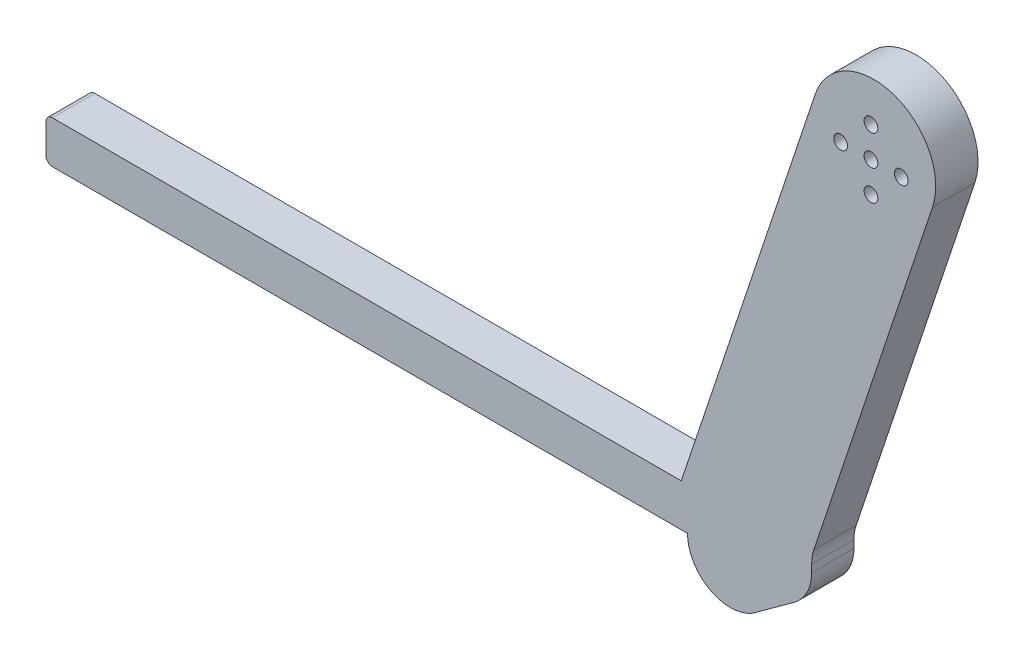
ISO-10303-21;
HEADER;
FILE_DESCRIPTION(('STEP AP214'),'2;1');
FILE_NAME('part.step','',(''),(''),'','','');
FILE_SCHEMA(('AUTOMOTIVE_DESIGN { 1 0 10303 214 1 1 1 1 }'));
ENDSEC;
DATA;
#1=APPLICATION_CONTEXT('core data for automotive mechanical design processes');
#2=APPLICATION_PROTOCOL_DEFINITION('international standard','automotive_design',2000,#1);
#3=PRODUCT_CONTEXT('',#1,'mechanical');
#4=PRODUCT('Part','Part','',(#3));
#5=PRODUCT_RELATED_PRODUCT_CATEGORY('part','',(#4));
#6=PRODUCT_DEFINITION_FORMATION('','',#4);
#7=PRODUCT_DEFINITION_CONTEXT('part definition',#1,'design');
#8=PRODUCT_DEFINITION('design','',#6,#7);
#9=PRODUCT_DEFINITION_SHAPE('','',#8);
#10=(LENGTH_UNIT() NAMED_UNIT(*) SI_UNIT(.MILLI.,.METRE.));
#11=(NAMED_UNIT(*) PLANE_ANGLE_UNIT() SI_UNIT($,.RADIAN.));
#12=(NAMED_UNIT(*) SI_UNIT($,.STERADIAN.) SOLID_ANGLE_UNIT());
#13=UNCERTAINTY_MEASURE_WITH_UNIT(LENGTH_MEASURE(1.E-05),#10,'distance_accuracy_value','');
#14=(GEOMETRIC_REPRESENTATION_CONTEXT(3) GLOBAL_UNCERTAINTY_ASSIGNED_CONTEXT((#13)) GLOBAL_UNIT_ASSIGNED_CONTEXT((#10,
#11,#12)) REPRESENTATION_CONTEXT('',''));
#15=CARTESIAN_POINT('',(0.,0.,0.));
#16=DIRECTION('',(0.,0.,1.));
#17=DIRECTION('',(1.,0.,0.));
#18=AXIS2_PLACEMENT_3D('',#15,#16,#17);
#19=CARTESIAN_POINT('',(-148.5,-1.50000000000002,10.));
#20=DIRECTION('',(0.,0.,1.));
#21=DIRECTION('',(1.,0.,0.));
#22=AXIS2_PLACEMENT_3D('',#19,#20,#21);
#23=PLANE('',#22);
#24=CARTESIAN_POINT('',(51.946529943188,88.1014202913223,10.));
#25=DIRECTION('',(0.,0.,1.));
#26=DIRECTION('',(1.,0.,0.));
#27=AXIS2_PLACEMENT_3D('',#24,#25,#26);
#28=CIRCLE('',#27,1.62000000000001);
#29=CARTESIAN_POINT('',(53.566529943188,88.1014202913223,10.));
#30=VERTEX_POINT('',#29);
#31=EDGE_CURVE('E402',#30,#30,#28,.T.);
#32=ORIENTED_EDGE('',*,*,#31,.F.);
#33=EDGE_LOOP('',(#32));
#34=FACE_BOUND('',#33,.T.);
#35=CARTESIAN_POINT('',(44.787529943188,88.1014202913223,10.));
#36=DIRECTION('',(0.,0.,1.));
#37=DIRECTION('',(1.,0.,0.));
#38=AXIS2_PLACEMENT_3D('',#35,#36,#37);
#39=CIRCLE('',#38,1.62000000000001);
#40=CARTESIAN_POINT('',(46.407529943188,88.1014202913223,10.));
#41=VERTEX_POINT('',#40);
#42=EDGE_CURVE('E405',#41,#41,#39,.T.);
#43=ORIENTED_EDGE('',*,*,#42,.F.);
#44=EDGE_LOOP('',(#43));
#45=FACE_BOUND('',#44,.T.);
#46=CARTESIAN_POINT('',(44.787529943188,95.2604202913223,10.));
#47=DIRECTION('',(0.,0.,1.));
#48=DIRECTION('',(1.,0.,0.));
#49=AXIS2_PLACEMENT_3D('',#46,#47,#48);
#50=CIRCLE('',#49,1.62000000000001);
#51=CARTESIAN_POINT('',(46.407529943188,95.2604202913223,10.));
#52=VERTEX_POINT('',#51);
#53=EDGE_CURVE('E401',#52,#52,#50,.T.);
#54=ORIENTED_EDGE('',*,*,#53,.F.);
#55=EDGE_LOOP('',(#54));
#56=FACE_BOUND('',#55,.T.);
#57=CARTESIAN_POINT('',(-148.5,-1.50000000000002,10.));
#58=DIRECTION('',(0.,0.,1.));
#59=DIRECTION('',(1.,0.,0.));
#60=AXIS2_PLACEMENT_3D('',#57,#58,#59);
#61=CIRCLE('',#60,1.5);
#62=CARTESIAN_POINT('',(-148.5,0.,10.));
#63=VERTEX_POINT('',#62);
#64=CARTESIAN_POINT('',(-150.,-1.5,10.));
#65=VERTEX_POINT('',#64);
#66=EDGE_CURVE('E200',#63,#65,#61,.T.);
#67=ORIENTED_EDGE('',*,*,#66,.T.);
#68=DIRECTION('',(0.,-1.,0.));
#69=VECTOR('',#68,1.);
#70=CARTESIAN_POINT('',(-150.,-1.5,10.));
#71=LINE('',#70,#69);
#72=CARTESIAN_POINT('',(-150.,-8.50000000000002,10.));
#73=VERTEX_POINT('',#72);
#74=EDGE_CURVE('E110',#65,#73,#71,.T.);
#75=ORIENTED_EDGE('',*,*,#74,.T.);
#76=CARTESIAN_POINT('',(-148.5,-8.50000000000002,10.));
#77=DIRECTION('',(0.,0.,1.));
#78=DIRECTION('',(1.,0.,0.));
#79=AXIS2_PLACEMENT_3D('',#76,#77,#78);
#80=CIRCLE('',#79,1.49999999999999);
#81=CARTESIAN_POINT('',(-148.5,-10.,10.));
#82=VERTEX_POINT('',#81);
#83=EDGE_CURVE('E227',#73,#82,#80,.T.);
#84=ORIENTED_EDGE('',*,*,#83,.T.);
#85=DIRECTION('',(1.,0.,0.));
#86=VECTOR('',#85,1.);
#87=CARTESIAN_POINT('',(-148.5,-10.,10.));
#88=LINE('',#87,#86);
#89=CARTESIAN_POINT('',(1.47401029250903,-10.,10.));
#90=VERTEX_POINT('',#89);
#91=EDGE_CURVE('E244',#82,#90,#88,.T.);
#92=ORIENTED_EDGE('',*,*,#91,.T.);
#93=CARTESIAN_POINT('',(11.5907783371728,-10.,10.));
#94=DIRECTION('',(0.,0.,1.));
#95=DIRECTION('',(1.,0.,0.));
#96=AXIS2_PLACEMENT_3D('',#93,#94,#95);
#97=CIRCLE('',#96,10.1167680446638);
#98=CARTESIAN_POINT('',(18.1803002583485,-17.6764051821068,10.));
#99=VERTEX_POINT('',#98);
#100=EDGE_CURVE('E241',#90,#99,#97,.T.);
#101=ORIENTED_EDGE('',*,*,#100,.T.);
#102=DIRECTION('',(0.808447886643731,0.588567765496281,0.));
#103=VECTOR('',#102,1.);
#104=CARTESIAN_POINT('',(18.1803002583485,-17.6764051821068,10.));
#105=LINE('',#104,#103);
#106=CARTESIAN_POINT('',(26.6705509316881,-11.4953167658129,10.));
#107=VERTEX_POINT('',#106);
#108=EDGE_CURVE('E243',#99,#107,#105,.T.);
#109=ORIENTED_EDGE('',*,*,#108,.T.);
#110=CARTESIAN_POINT('',(20.7848732767254,-3.41083789937558,10.));
#111=DIRECTION('',(0.,0.,-1.));
#112=DIRECTION('',(-1.,0.,0.));
#113=AXIS2_PLACEMENT_3D('',#110,#111,#112);
#114=CIRCLE('',#113,10.);
#115=CARTESIAN_POINT('',(30.7848732767254,-3.41083789937554,10.));
#116=VERTEX_POINT('',#115);
#117=EDGE_CURVE('E246',#116,#107,#114,.T.);
#118=ORIENTED_EDGE('',*,*,#117,.F.);
#119=DIRECTION('',(0.,1.,0.));
#120=VECTOR('',#119,1.);
#121=CARTESIAN_POINT('',(30.7848732767254,-3.41083789937554,10.));
#122=LINE('',#121,#120);
#123=CARTESIAN_POINT('',(30.7848732767254,-1.62277660168383,10.));
#124=VERTEX_POINT('',#123);
#125=EDGE_CURVE('E253',#116,#124,#122,.T.);
#126=ORIENTED_EDGE('',*,*,#125,.T.);
#127=CARTESIAN_POINT('',(40.7848732767254,-1.62277660168379,10.));
#128=DIRECTION('',(0.,0.,1.));
#129=DIRECTION('',(1.,0.,0.));
#130=AXIS2_PLACEMENT_3D('',#127,#128,#129);
#131=CIRCLE('',#130,10.);
#132=CARTESIAN_POINT('',(31.2980402962202,1.53950105848462,10.));
#133=VERTEX_POINT('',#132);
#134=EDGE_CURVE('E255',#133,#124,#131,.T.);
#135=ORIENTED_EDGE('',*,*,#134,.F.);
#136=DIRECTION('',(0.316227766016838,0.948683298050514,0.));
#137=VECTOR('',#136,1.);
#138=CARTESIAN_POINT('',(31.2980402962202,1.53950105848462,10.));
#139=LINE('',#138,#137);
#140=CARTESIAN_POINT('',(59.3291625507366,85.6328678220338,10.));
#141=VERTEX_POINT('',#140);
#142=EDGE_CURVE('E159',#133,#141,#139,.T.);
#143=ORIENTED_EDGE('',*,*,#142,.T.);
#144=CARTESIAN_POINT('',(45.4759695762102,90.2505988135426,10.));
#145=DIRECTION('',(0.,0.,-1.));
#146=DIRECTION('',(-1.,0.,0.));
#147=AXIS2_PLACEMENT_3D('',#144,#145,#146);
#148=CIRCLE('',#147,14.6025475551155);
#149=CARTESIAN_POINT('',(31.6227766016838,94.8683298050514,10.));
#150=VERTEX_POINT('',#149);
#151=EDGE_CURVE('E144',#150,#141,#148,.T.);
#152=ORIENTED_EDGE('',*,*,#151,.F.);
#153=DIRECTION('',(0.316227766016838,0.948683298050514,0.));
#154=VECTOR('',#153,1.);
#155=CARTESIAN_POINT('',(0.,0.,10.));
#156=LINE('',#155,#154);
#157=CARTESIAN_POINT('',(0.,0.,10.));
#158=VERTEX_POINT('',#157);
#159=EDGE_CURVE('E156',#158,#150,#156,.T.);
#160=ORIENTED_EDGE('',*,*,#159,.F.);
#161=DIRECTION('',(1.,0.,0.));
#162=VECTOR('',#161,1.);
#163=CARTESIAN_POINT('',(-148.5,0.,10.));
#164=LINE('',#163,#162);
#165=EDGE_CURVE('E163',#63,#158,#164,.T.);
#166=ORIENTED_EDGE('',*,*,#165,.F.);
#167=EDGE_LOOP('',(#67,#75,#84,#92,#101,#109,#118,#126,#135,#143,#152,#160,#166));
#168=FACE_BOUND('',#167,.T.);
#169=CARTESIAN_POINT('',(44.787529943188,80.9424202913223,10.));
#170=DIRECTION('',(0.,0.,-1.));
#171=DIRECTION('',(-1.,0.,0.));
#172=AXIS2_PLACEMENT_3D('',#169,#170,#171);
#173=CIRCLE('',#172,1.62000000000001);
#174=CARTESIAN_POINT('',(43.167529943188,80.9424202913223,10.));
#175=VERTEX_POINT('',#174);
#176=EDGE_CURVE('E398',#175,#175,#173,.T.);
#177=ORIENTED_EDGE('',*,*,#176,.T.);
#178=EDGE_LOOP('',(#177));
#179=FACE_BOUND('',#178,.T.);
#180=CARTESIAN_POINT('',(37.628529943188,88.1014202913223,10.));
#181=DIRECTION('',(0.,0.,-1.));
#182=DIRECTION('',(-1.,0.,0.));
#183=AXIS2_PLACEMENT_3D('',#180,#181,#182);
#184=CIRCLE('',#183,1.62000000000001);
#185=CARTESIAN_POINT('',(36.008529943188,88.1014202913223,10.));
#186=VERTEX_POINT('',#185);
#187=EDGE_CURVE('E171',#186,#186,#184,.T.);
#188=ORIENTED_EDGE('',*,*,#187,.T.);
#189=EDGE_LOOP('',(#188));
#190=FACE_BOUND('',#189,.T.);
#191=ADVANCED_FACE('F39',(#34,#45,#56,#168,#179,#190),#23,.T.);
#192=CARTESIAN_POINT('',(-148.5,-1.50000000000002,0.));
#193=DIRECTION('',(0.,0.,1.));
#194=DIRECTION('',(1.,0.,0.));
#195=AXIS2_PLACEMENT_3D('',#192,#193,#194);
#196=PLANE('',#195);
#197=CARTESIAN_POINT('',(44.787529943188,88.1014202913223,0.));
#198=DIRECTION('',(0.,0.,1.));
#199=DIRECTION('',(1.,0.,0.));
#200=AXIS2_PLACEMENT_3D('',#197,#198,#199);
#201=CIRCLE('',#200,9.80000000000001);
#202=CARTESIAN_POINT('',(54.587529943188,88.1014202913223,0.));
#203=VERTEX_POINT('',#202);
#204=EDGE_CURVE('E382',#203,#203,#201,.T.);
#205=ORIENTED_EDGE('',*,*,#204,.T.);
#206=EDGE_LOOP('',(#205));
#207=FACE_BOUND('',#206,.T.);
#208=CARTESIAN_POINT('',(-148.5,-1.50000000000002,0.));
#209=DIRECTION('',(0.,0.,1.));
#210=DIRECTION('',(1.,0.,0.));
#211=AXIS2_PLACEMENT_3D('',#208,#209,#210);
#212=CIRCLE('',#211,1.5);
#213=CARTESIAN_POINT('',(-148.5,0.,0.));
#214=VERTEX_POINT('',#213);
#215=CARTESIAN_POINT('',(-150.,-1.5,0.));
#216=VERTEX_POINT('',#215);
#217=EDGE_CURVE('E168',#214,#216,#212,.T.);
#218=ORIENTED_EDGE('',*,*,#217,.F.);
#219=DIRECTION('',(1.,0.,0.));
#220=VECTOR('',#219,1.);
#221=CARTESIAN_POINT('',(-148.5,0.,0.));
#222=LINE('',#221,#220);
#223=CARTESIAN_POINT('',(0.,0.,0.));
#224=VERTEX_POINT('',#223);
#225=EDGE_CURVE('E197',#214,#224,#222,.T.);
#226=ORIENTED_EDGE('',*,*,#225,.T.);
#227=DIRECTION('',(0.316227766016838,0.948683298050514,0.));
#228=VECTOR('',#227,1.);
#229=CARTESIAN_POINT('',(0.,0.,0.));
#230=LINE('',#229,#228);
#231=CARTESIAN_POINT('',(31.6227766016838,94.8683298050514,0.));
#232=VERTEX_POINT('',#231);
#233=EDGE_CURVE('E195',#224,#232,#230,.T.);
#234=ORIENTED_EDGE('',*,*,#233,.T.);
#235=CARTESIAN_POINT('',(45.4759695762102,90.2505988135426,0.));
#236=DIRECTION('',(0.,0.,-1.));
#237=DIRECTION('',(-1.,0.,0.));
#238=AXIS2_PLACEMENT_3D('',#235,#236,#237);
#239=CIRCLE('',#238,14.6025475551155);
#240=CARTESIAN_POINT('',(59.3291625507366,85.6328678220338,0.));
#241=VERTEX_POINT('',#240);
#242=EDGE_CURVE('E146',#232,#241,#239,.T.);
#243=ORIENTED_EDGE('',*,*,#242,.T.);
#244=DIRECTION('',(0.316227766016838,0.948683298050514,0.));
#245=VECTOR('',#244,1.);
#246=CARTESIAN_POINT('',(31.2980402962202,1.53950105848462,0.));
#247=LINE('',#246,#245);
#248=CARTESIAN_POINT('',(31.2980402962202,1.53950105848462,0.));
#249=VERTEX_POINT('',#248);
#250=EDGE_CURVE('E191',#249,#241,#247,.T.);
#251=ORIENTED_EDGE('',*,*,#250,.F.);
#252=CARTESIAN_POINT('',(40.7848732767254,-1.62277660168379,0.));
#253=DIRECTION('',(0.,0.,1.));
#254=DIRECTION('',(1.,0.,0.));
#255=AXIS2_PLACEMENT_3D('',#252,#253,#254);
#256=CIRCLE('',#255,10.);
#257=CARTESIAN_POINT('',(30.7848732767254,-1.62277660168383,0.));
#258=VERTEX_POINT('',#257);
#259=EDGE_CURVE('E188',#249,#258,#256,.T.);
#260=ORIENTED_EDGE('',*,*,#259,.T.);
#261=DIRECTION('',(0.,1.,0.));
#262=VECTOR('',#261,1.);
#263=CARTESIAN_POINT('',(30.7848732767254,-3.41083789937554,0.));
#264=LINE('',#263,#262);
#265=CARTESIAN_POINT('',(30.7848732767254,-3.41083789937554,0.));
#266=VERTEX_POINT('',#265);
#267=EDGE_CURVE('E185',#266,#258,#264,.T.);
#268=ORIENTED_EDGE('',*,*,#267,.F.);
#269=CARTESIAN_POINT('',(20.7848732767254,-3.41083789937558,0.));
#270=DIRECTION('',(0.,0.,-1.));
#271=DIRECTION('',(-1.,0.,0.));
#272=AXIS2_PLACEMENT_3D('',#269,#270,#271);
#273=CIRCLE('',#272,10.);
#274=CARTESIAN_POINT('',(26.6705509316881,-11.4953167658129,0.));
#275=VERTEX_POINT('',#274);
#276=EDGE_CURVE('E182',#266,#275,#273,.T.);
#277=ORIENTED_EDGE('',*,*,#276,.T.);
#278=DIRECTION('',(0.808447886643731,0.588567765496281,0.));
#279=VECTOR('',#278,1.);
#280=CARTESIAN_POINT('',(18.1803002583485,-17.6764051821068,0.));
#281=LINE('',#280,#279);
#282=CARTESIAN_POINT('',(18.1803002583485,-17.6764051821068,0.));
#283=VERTEX_POINT('',#282);
#284=EDGE_CURVE('E179',#283,#275,#281,.T.);
#285=ORIENTED_EDGE('',*,*,#284,.F.);
#286=CARTESIAN_POINT('',(11.5907783371728,-10.,0.));
#287=DIRECTION('',(0.,0.,1.));
#288=DIRECTION('',(1.,0.,0.));
#289=AXIS2_PLACEMENT_3D('',#286,#287,#288);
#290=CIRCLE('',#289,10.1167680446638);
#291=CARTESIAN_POINT('',(1.47401029250903,-10.,0.));
#292=VERTEX_POINT('',#291);
#293=EDGE_CURVE('E177',#292,#283,#290,.T.);
#294=ORIENTED_EDGE('',*,*,#293,.F.);
#295=DIRECTION('',(1.,0.,0.));
#296=VECTOR('',#295,1.);
#297=CARTESIAN_POINT('',(-148.5,-10.,0.));
#298=LINE('',#297,#296);
#299=CARTESIAN_POINT('',(-148.5,-10.,0.));
#300=VERTEX_POINT('',#299);
#301=EDGE_CURVE('E175',#300,#292,#298,.T.);
#302=ORIENTED_EDGE('',*,*,#301,.F.);
#303=CARTESIAN_POINT('',(-148.5,-8.50000000000002,0.));
#304=DIRECTION('',(0.,0.,1.));
#305=DIRECTION('',(1.,0.,0.));
#306=AXIS2_PLACEMENT_3D('',#303,#304,#305);
#307=CIRCLE('',#306,1.49999999999999);
#308=CARTESIAN_POINT('',(-150.,-8.50000000000002,0.));
#309=VERTEX_POINT('',#308);
#310=EDGE_CURVE('E173',#309,#300,#307,.T.);
#311=ORIENTED_EDGE('',*,*,#310,.F.);
#312=DIRECTION('',(0.,-1.,0.));
#313=VECTOR('',#312,1.);
#314=CARTESIAN_POINT('',(-150.,-1.5,0.));
#315=LINE('',#314,#313);
#316=EDGE_CURVE('E170',#216,#309,#315,.T.);
#317=ORIENTED_EDGE('',*,*,#316,.F.);
#318=EDGE_LOOP('',(#218,#226,#234,#243,#251,#260,#268,#277,#285,#294,#302,#311,#317));
#319=FACE_BOUND('',#318,.T.);
#320=ADVANCED_FACE('F230',(#207,#319),#196,.F.);
#321=CARTESIAN_POINT('',(-148.5,-1.50000000000002,10.));
#322=DIRECTION('',(0.,0.,-1.));
#323=DIRECTION('',(-1.,0.,0.));
#324=AXIS2_PLACEMENT_3D('',#321,#322,#323);
#325=CYLINDRICAL_SURFACE('',#324,1.5);
#326=ORIENTED_EDGE('',*,*,#217,.T.);
#327=DIRECTION('',(0.,0.,-1.));
#328=VECTOR('',#327,1.);
#329=CARTESIAN_POINT('',(-150.,-1.5,10.));
#330=LINE('',#329,#328);
#331=EDGE_CURVE('E11',#65,#216,#330,.T.);
#332=ORIENTED_EDGE('',*,*,#331,.F.);
#333=ORIENTED_EDGE('',*,*,#66,.F.);
#334=DIRECTION('',(0.,0.,-1.));
#335=VECTOR('',#334,1.);
#336=CARTESIAN_POINT('',(-148.5,0.,10.));
#337=LINE('',#336,#335);
#338=EDGE_CURVE('E57',#63,#214,#337,.T.);
#339=ORIENTED_EDGE('',*,*,#338,.T.);
#340=EDGE_LOOP('',(#326,#332,#333,#339));
#341=FACE_BOUND('',#340,.T.);
#342=ADVANCED_FACE('F41',(#341),#325,.T.);
#343=CARTESIAN_POINT('',(-150.,-1.5,10.));
#344=DIRECTION('',(1.,0.,0.));
#345=DIRECTION('',(0.,1.,0.));
#346=AXIS2_PLACEMENT_3D('',#343,#344,#345);
#347=PLANE('',#346);
#348=ORIENTED_EDGE('',*,*,#316,.T.);
#349=DIRECTION('',(0.,0.,-1.));
#350=VECTOR('',#349,1.);
#351=CARTESIAN_POINT('',(-150.,-8.50000000000002,10.));
#352=LINE('',#351,#350);
#353=EDGE_CURVE('E49',#73,#309,#352,.T.);
#354=ORIENTED_EDGE('',*,*,#353,.F.);
#355=ORIENTED_EDGE('',*,*,#74,.F.);
#356=ORIENTED_EDGE('',*,*,#331,.T.);
#357=EDGE_LOOP('',(#348,#354,#355,#356));
#358=FACE_BOUND('',#357,.T.);
#359=ADVANCED_FACE('F414',(#358),#347,.F.);
#360=CARTESIAN_POINT('',(-148.5,-8.50000000000002,10.));
#361=DIRECTION('',(0.,0.,-1.));
#362=DIRECTION('',(-1.,0.,0.));
#363=AXIS2_PLACEMENT_3D('',#360,#361,#362);
#364=CYLINDRICAL_SURFACE('',#363,1.49999999999999);
#365=ORIENTED_EDGE('',*,*,#310,.T.);
#366=DIRECTION('',(0.,0.,-1.));
#367=VECTOR('',#366,1.);
#368=CARTESIAN_POINT('',(-148.5,-10.,10.));
#369=LINE('',#368,#367);
#370=EDGE_CURVE('E218',#82,#300,#369,.T.);
#371=ORIENTED_EDGE('',*,*,#370,.F.);
#372=ORIENTED_EDGE('',*,*,#83,.F.);
#373=ORIENTED_EDGE('',*,*,#353,.T.);
#374=EDGE_LOOP('',(#365,#371,#372,#373));
#375=FACE_BOUND('',#374,.T.);
#376=ADVANCED_FACE('F225',(#375),#364,.T.);
#377=CARTESIAN_POINT('',(-148.5,-10.,10.));
#378=DIRECTION('',(0.,1.,0.));
#379=DIRECTION('',(0.,0.,1.));
#380=AXIS2_PLACEMENT_3D('',#377,#378,#379);
#381=PLANE('',#380);
#382=ORIENTED_EDGE('',*,*,#301,.T.);
#383=DIRECTION('',(0.,0.,-1.));
#384=VECTOR('',#383,1.);
#385=CARTESIAN_POINT('',(1.47401029250903,-10.,10.));
#386=LINE('',#385,#384);
#387=EDGE_CURVE('E215',#90,#292,#386,.T.);
#388=ORIENTED_EDGE('',*,*,#387,.F.);
#389=ORIENTED_EDGE('',*,*,#91,.F.);
#390=ORIENTED_EDGE('',*,*,#370,.T.);
#391=EDGE_LOOP('',(#382,#388,#389,#390));
#392=FACE_BOUND('',#391,.T.);
#393=ADVANCED_FACE('F235',(#392),#381,.F.);
#394=CARTESIAN_POINT('',(11.5907783371728,-10.,10.));
#395=DIRECTION('',(0.,0.,-1.));
#396=DIRECTION('',(-1.,0.,0.));
#397=AXIS2_PLACEMENT_3D('',#394,#395,#396);
#398=CYLINDRICAL_SURFACE('',#397,10.1167680446638);
#399=ORIENTED_EDGE('',*,*,#293,.T.);
#400=DIRECTION('',(0.,0.,-1.));
#401=VECTOR('',#400,1.);
#402=CARTESIAN_POINT('',(18.1803002583485,-17.6764051821068,10.));
#403=LINE('',#402,#401);
#404=EDGE_CURVE('E212',#99,#283,#403,.T.);
#405=ORIENTED_EDGE('',*,*,#404,.F.);
#406=ORIENTED_EDGE('',*,*,#100,.F.);
#407=ORIENTED_EDGE('',*,*,#387,.T.);
#408=EDGE_LOOP('',(#399,#405,#406,#407));
#409=FACE_BOUND('',#408,.T.);
#410=ADVANCED_FACE('F239',(#409),#398,.T.);
#411=CARTESIAN_POINT('',(18.1803002583485,-17.6764051821068,10.));
#412=DIRECTION('',(-0.588567765496281,0.808447886643731,0.));
#413=DIRECTION('',(-0.808447886643731,-0.588567765496281,0.));
#414=AXIS2_PLACEMENT_3D('',#411,#412,#413);
#415=PLANE('',#414);
#416=ORIENTED_EDGE('',*,*,#284,.T.);
#417=DIRECTION('',(0.,0.,-1.));
#418=VECTOR('',#417,1.);
#419=CARTESIAN_POINT('',(26.6705509316881,-11.4953167658129,10.));
#420=LINE('',#419,#418);
#421=EDGE_CURVE('E210',#107,#275,#420,.T.);
#422=ORIENTED_EDGE('',*,*,#421,.F.);
#423=ORIENTED_EDGE('',*,*,#108,.F.);
#424=ORIENTED_EDGE('',*,*,#404,.T.);
#425=EDGE_LOOP('',(#416,#422,#423,#424));
#426=FACE_BOUND('',#425,.T.);
#427=ADVANCED_FACE('F426',(#426),#415,.F.);
#428=CARTESIAN_POINT('',(20.7848732767254,-3.41083789937558,10.));
#429=DIRECTION('',(0.,0.,-1.));
#430=DIRECTION('',(-1.,0.,0.));
#431=AXIS2_PLACEMENT_3D('',#428,#429,#430);
#432=CYLINDRICAL_SURFACE('',#431,10.);
#433=ORIENTED_EDGE('',*,*,#276,.F.);
#434=DIRECTION('',(0.,0.,-1.));
#435=VECTOR('',#434,1.);
#436=CARTESIAN_POINT('',(30.7848732767254,-3.41083789937554,10.));
#437=LINE('',#436,#435);
#438=EDGE_CURVE('E208',#116,#266,#437,.T.);
#439=ORIENTED_EDGE('',*,*,#438,.F.);
#440=ORIENTED_EDGE('',*,*,#117,.T.);
#441=ORIENTED_EDGE('',*,*,#421,.T.);
#442=EDGE_LOOP('',(#433,#439,#440,#441));
#443=FACE_BOUND('',#442,.T.);
#444=ADVANCED_FACE('F429',(#443),#432,.T.);
#445=CARTESIAN_POINT('',(30.7848732767254,-3.41083789937554,10.));
#446=DIRECTION('',(-1.,0.,0.));
#447=DIRECTION('',(0.,0.,1.));
#448=AXIS2_PLACEMENT_3D('',#445,#446,#447);
#449=PLANE('',#448);
#450=ORIENTED_EDGE('',*,*,#267,.T.);
#451=DIRECTION('',(0.,0.,-1.));
#452=VECTOR('',#451,1.);
#453=CARTESIAN_POINT('',(30.7848732767254,-1.62277660168383,10.));
#454=LINE('',#453,#452);
#455=EDGE_CURVE('E206',#124,#258,#454,.T.);
#456=ORIENTED_EDGE('',*,*,#455,.F.);
#457=ORIENTED_EDGE('',*,*,#125,.F.);
#458=ORIENTED_EDGE('',*,*,#438,.T.);
#459=EDGE_LOOP('',(#450,#456,#457,#458));
#460=FACE_BOUND('',#459,.T.);
#461=ADVANCED_FACE('F264',(#460),#449,.F.);
#462=CARTESIAN_POINT('',(40.7848732767254,-1.62277660168379,10.));
#463=DIRECTION('',(0.,0.,-1.));
#464=DIRECTION('',(-1.,0.,0.));
#465=AXIS2_PLACEMENT_3D('',#462,#463,#464);
#466=CYLINDRICAL_SURFACE('',#465,10.);
#467=ORIENTED_EDGE('',*,*,#259,.F.);
#468=DIRECTION('',(0.,0.,-1.));
#469=VECTOR('',#468,1.);
#470=CARTESIAN_POINT('',(31.2980402962202,1.53950105848462,10.));
#471=LINE('',#470,#469);
#472=EDGE_CURVE('E204',#133,#249,#471,.T.);
#473=ORIENTED_EDGE('',*,*,#472,.F.);
#474=ORIENTED_EDGE('',*,*,#134,.T.);
#475=ORIENTED_EDGE('',*,*,#455,.T.);
#476=EDGE_LOOP('',(#467,#473,#474,#475));
#477=FACE_BOUND('',#476,.T.);
#478=ADVANCED_FACE('F259',(#477),#466,.F.);
#479=CARTESIAN_POINT('',(31.2980402962202,1.53950105848462,10.));
#480=DIRECTION('',(-0.948683298050514,0.316227766016838,0.));
#481=DIRECTION('',(-0.316227766016838,-0.948683298050514,0.));
#482=AXIS2_PLACEMENT_3D('',#479,#480,#481);
#483=PLANE('',#482);
#484=ORIENTED_EDGE('',*,*,#250,.T.);
#485=DIRECTION('',(0.,0.,-1.));
#486=VECTOR('',#485,1.);
#487=CARTESIAN_POINT('',(59.3291625507366,85.6328678220338,10.));
#488=LINE('',#487,#486);
#489=EDGE_CURVE('E150',#141,#241,#488,.T.);
#490=ORIENTED_EDGE('',*,*,#489,.F.);
#491=ORIENTED_EDGE('',*,*,#142,.F.);
#492=ORIENTED_EDGE('',*,*,#472,.T.);
#493=EDGE_LOOP('',(#484,#490,#491,#492));
#494=FACE_BOUND('',#493,.T.);
#495=ADVANCED_FACE('F269',(#494),#483,.F.);
#496=CARTESIAN_POINT('',(45.4759695762102,90.2505988135426,10.));
#497=DIRECTION('',(0.,0.,-1.));
#498=DIRECTION('',(-1.,0.,0.));
#499=AXIS2_PLACEMENT_3D('',#496,#497,#498);
#500=CYLINDRICAL_SURFACE('',#499,14.6025475551155);
#501=ORIENTED_EDGE('',*,*,#242,.F.);
#502=DIRECTION('',(0.,0.,-1.));
#503=VECTOR('',#502,1.);
#504=CARTESIAN_POINT('',(31.6227766016838,94.8683298050514,10.));
#505=LINE('',#504,#503);
#506=EDGE_CURVE('E141',#150,#232,#505,.T.);
#507=ORIENTED_EDGE('',*,*,#506,.F.);
#508=ORIENTED_EDGE('',*,*,#151,.T.);
#509=ORIENTED_EDGE('',*,*,#489,.T.);
#510=EDGE_LOOP('',(#501,#507,#508,#509));
#511=FACE_BOUND('',#510,.T.);
#512=ADVANCED_FACE('F143',(#511),#500,.T.);
#513=CARTESIAN_POINT('',(0.,0.,10.));
#514=DIRECTION('',(-0.948683298050514,0.316227766016838,0.));
#515=DIRECTION('',(-0.316227766016838,-0.948683298050514,0.));
#516=AXIS2_PLACEMENT_3D('',#513,#514,#515);
#517=PLANE('',#516);
#518=ORIENTED_EDGE('',*,*,#233,.F.);
#519=DIRECTION('',(0.,0.,-1.));
#520=VECTOR('',#519,1.);
#521=CARTESIAN_POINT('',(0.,0.,10.));
#522=LINE('',#521,#520);
#523=EDGE_CURVE('E98',#158,#224,#522,.T.);
#524=ORIENTED_EDGE('',*,*,#523,.F.);
#525=ORIENTED_EDGE('',*,*,#159,.T.);
#526=ORIENTED_EDGE('',*,*,#506,.T.);
#527=EDGE_LOOP('',(#518,#524,#525,#526));
#528=FACE_BOUND('',#527,.T.);
#529=ADVANCED_FACE('F162',(#528),#517,.T.);
#530=CARTESIAN_POINT('',(-148.5,0.,10.));
#531=DIRECTION('',(0.,1.,0.));
#532=DIRECTION('',(-1.,0.,0.));
#533=AXIS2_PLACEMENT_3D('',#530,#531,#532);
#534=PLANE('',#533);
#535=ORIENTED_EDGE('',*,*,#225,.F.);
#536=ORIENTED_EDGE('',*,*,#338,.F.);
#537=ORIENTED_EDGE('',*,*,#165,.T.);
#538=ORIENTED_EDGE('',*,*,#523,.T.);
#539=EDGE_LOOP('',(#535,#536,#537,#538));
#540=FACE_BOUND('',#539,.T.);
#541=ADVANCED_FACE('F293',(#540),#534,.T.);
#542=CARTESIAN_POINT('',(44.787529943188,95.2604202913223,10.));
#543=DIRECTION('',(0.,0.,-1.));
#544=DIRECTION('',(-1.,0.,0.));
#545=AXIS2_PLACEMENT_3D('',#542,#543,#544);
#546=CYLINDRICAL_SURFACE('',#545,1.62000000000001);
#547=CARTESIAN_POINT('',(44.787529943188,95.2604202913223,2.2));
#548=DIRECTION('',(0.,0.,1.));
#549=DIRECTION('',(1.,0.,0.));
#550=AXIS2_PLACEMENT_3D('',#547,#548,#549);
#551=CIRCLE('',#550,1.62000000000001);
#552=CARTESIAN_POINT('',(46.407529943188,95.2604202913223,2.2));
#553=VERTEX_POINT('',#552);
#554=EDGE_CURVE('E395',#553,#553,#551,.T.);
#555=ORIENTED_EDGE('',*,*,#554,.F.);
#556=EDGE_LOOP('',(#555));
#557=FACE_BOUND('',#556,.T.);
#558=ORIENTED_EDGE('',*,*,#53,.T.);
#559=EDGE_LOOP('',(#558));
#560=FACE_BOUND('',#559,.T.);
#561=ADVANCED_FACE('F295',(#557,#560),#546,.F.);
#562=CARTESIAN_POINT('',(44.787529943188,88.1014202913223,10.));
#563=DIRECTION('',(0.,0.,-1.));
#564=DIRECTION('',(-1.,0.,0.));
#565=AXIS2_PLACEMENT_3D('',#562,#563,#564);
#566=CYLINDRICAL_SURFACE('',#565,1.62000000000001);
#567=CARTESIAN_POINT('',(44.787529943188,88.1014202913223,2.2));
#568=DIRECTION('',(0.,0.,1.));
#569=DIRECTION('',(1.,0.,0.));
#570=AXIS2_PLACEMENT_3D('',#567,#568,#569);
#571=CIRCLE('',#570,1.62000000000001);
#572=CARTESIAN_POINT('',(46.407529943188,88.1014202913223,2.2));
#573=VERTEX_POINT('',#572);
#574=EDGE_CURVE('E392',#573,#573,#571,.T.);
#575=ORIENTED_EDGE('',*,*,#574,.F.);
#576=EDGE_LOOP('',(#575));
#577=FACE_BOUND('',#576,.T.);
#578=ORIENTED_EDGE('',*,*,#42,.T.);
#579=EDGE_LOOP('',(#578));
#580=FACE_BOUND('',#579,.T.);
#581=ADVANCED_FACE('F290',(#577,#580),#566,.F.);
#582=CARTESIAN_POINT('',(51.946529943188,88.1014202913223,10.));
#583=DIRECTION('',(0.,0.,-1.));
#584=DIRECTION('',(-1.,0.,0.));
#585=AXIS2_PLACEMENT_3D('',#582,#583,#584);
#586=CYLINDRICAL_SURFACE('',#585,1.62000000000001);
#587=CARTESIAN_POINT('',(51.946529943188,88.1014202913223,2.2));
#588=DIRECTION('',(0.,0.,1.));
#589=DIRECTION('',(1.,0.,0.));
#590=AXIS2_PLACEMENT_3D('',#587,#588,#589);
#591=CIRCLE('',#590,1.62000000000001);
#592=CARTESIAN_POINT('',(53.566529943188,88.1014202913223,2.2));
#593=VERTEX_POINT('',#592);
#594=EDGE_CURVE('E389',#593,#593,#591,.T.);
#595=ORIENTED_EDGE('',*,*,#594,.F.);
#596=EDGE_LOOP('',(#595));
#597=FACE_BOUND('',#596,.T.);
#598=ORIENTED_EDGE('',*,*,#31,.T.);
#599=EDGE_LOOP('',(#598));
#600=FACE_BOUND('',#599,.T.);
#601=ADVANCED_FACE('F332',(#597,#600),#586,.F.);
#602=CARTESIAN_POINT('',(44.787529943188,80.9424202913223,10.));
#603=DIRECTION('',(0.,0.,-1.));
#604=DIRECTION('',(-1.,0.,0.));
#605=AXIS2_PLACEMENT_3D('',#602,#603,#604);
#606=CYLINDRICAL_SURFACE('',#605,1.62000000000001);
#607=CARTESIAN_POINT('',(44.787529943188,80.9424202913223,2.2));
#608=DIRECTION('',(0.,0.,1.));
#609=DIRECTION('',(1.,0.,0.));
#610=AXIS2_PLACEMENT_3D('',#607,#608,#609);
#611=CIRCLE('',#610,1.62000000000001);
#612=CARTESIAN_POINT('',(46.407529943188,80.9424202913223,2.2));
#613=VERTEX_POINT('',#612);
#614=EDGE_CURVE('E386',#613,#613,#611,.F.);
#615=ORIENTED_EDGE('',*,*,#614,.T.);
#616=EDGE_LOOP('',(#615));
#617=FACE_BOUND('',#616,.T.);
#618=ORIENTED_EDGE('',*,*,#176,.F.);
#619=EDGE_LOOP('',(#618));
#620=FACE_BOUND('',#619,.T.);
#621=ADVANCED_FACE('F339',(#617,#620),#606,.F.);
#622=CARTESIAN_POINT('',(37.628529943188,88.1014202913223,10.));
#623=DIRECTION('',(0.,0.,-1.));
#624=DIRECTION('',(-1.,0.,0.));
#625=AXIS2_PLACEMENT_3D('',#622,#623,#624);
#626=CYLINDRICAL_SURFACE('',#625,1.62000000000001);
#627=CARTESIAN_POINT('',(37.628529943188,88.1014202913223,2.2));
#628=DIRECTION('',(0.,0.,1.));
#629=DIRECTION('',(1.,0.,0.));
#630=AXIS2_PLACEMENT_3D('',#627,#628,#629);
#631=CIRCLE('',#630,1.62000000000001);
#632=CARTESIAN_POINT('',(39.248529943188,88.1014202913223,2.2));
#633=VERTEX_POINT('',#632);
#634=EDGE_CURVE('E43',#633,#633,#631,.F.);
#635=ORIENTED_EDGE('',*,*,#634,.T.);
#636=EDGE_LOOP('',(#635));
#637=FACE_BOUND('',#636,.T.);
#638=ORIENTED_EDGE('',*,*,#187,.F.);
#639=EDGE_LOOP('',(#638));
#640=FACE_BOUND('',#639,.T.);
#641=ADVANCED_FACE('F347',(#637,#640),#626,.F.);
#642=CARTESIAN_POINT('',(44.787529943188,88.1014202913223,2.2));
#643=DIRECTION('',(0.,0.,1.));
#644=DIRECTION('',(1.,0.,0.));
#645=AXIS2_PLACEMENT_3D('',#642,#643,#644);
#646=PLANE('',#645);
#647=ORIENTED_EDGE('',*,*,#554,.T.);
#648=EDGE_LOOP('',(#647));
#649=FACE_BOUND('',#648,.T.);
#650=ORIENTED_EDGE('',*,*,#574,.T.);
#651=EDGE_LOOP('',(#650));
#652=FACE_BOUND('',#651,.T.);
#653=ORIENTED_EDGE('',*,*,#594,.T.);
#654=EDGE_LOOP('',(#653));
#655=FACE_BOUND('',#654,.T.);
#656=ORIENTED_EDGE('',*,*,#634,.F.);
#657=EDGE_LOOP('',(#656));
#658=FACE_BOUND('',#657,.T.);
#659=CARTESIAN_POINT('',(44.787529943188,88.1014202913223,2.2));
#660=DIRECTION('',(0.,0.,1.));
#661=DIRECTION('',(1.,0.,0.));
#662=AXIS2_PLACEMENT_3D('',#659,#660,#661);
#663=CIRCLE('',#662,9.80000000000001);
#664=CARTESIAN_POINT('',(54.587529943188,88.1014202913223,2.2));
#665=VERTEX_POINT('',#664);
#666=EDGE_CURVE('E379',#665,#665,#663,.T.);
#667=ORIENTED_EDGE('',*,*,#666,.F.);
#668=EDGE_LOOP('',(#667));
#669=FACE_BOUND('',#668,.T.);
#670=ORIENTED_EDGE('',*,*,#614,.F.);
#671=EDGE_LOOP('',(#670));
#672=FACE_BOUND('',#671,.T.);
#673=ADVANCED_FACE('F355',(#649,#652,#655,#658,#669,#672),#646,.F.);
#674=CARTESIAN_POINT('',(44.787529943188,88.1014202913223,2.2));
#675=DIRECTION('',(0.,0.,-1.));
#676=DIRECTION('',(-1.,0.,0.));
#677=AXIS2_PLACEMENT_3D('',#674,#675,#676);
#678=CYLINDRICAL_SURFACE('',#677,9.80000000000001);
#679=ORIENTED_EDGE('',*,*,#666,.T.);
#680=EDGE_LOOP('',(#679));
#681=FACE_BOUND('',#680,.T.);
#682=ORIENTED_EDGE('',*,*,#204,.F.);
#683=EDGE_LOOP('',(#682));
#684=FACE_BOUND('',#683,.T.);
#685=ADVANCED_FACE('F363',(#681,#684),#678,.F.);
#686=CLOSED_SHELL('',(#191,#320,#342,#359,#376,#393,#410,#427,#444,#461,#478,#495,#512,#529,
#541,#561,#581,#601,#621,#641,#673,#685));
#687=MANIFOLD_SOLID_BREP('B2',#686);
#688=ADVANCED_BREP_SHAPE_REPRESENTATION('',(#18,#687),#14);
#689=SHAPE_DEFINITION_REPRESENTATION(#9,#688);
ENDSEC;
END-ISO-10303-21;
